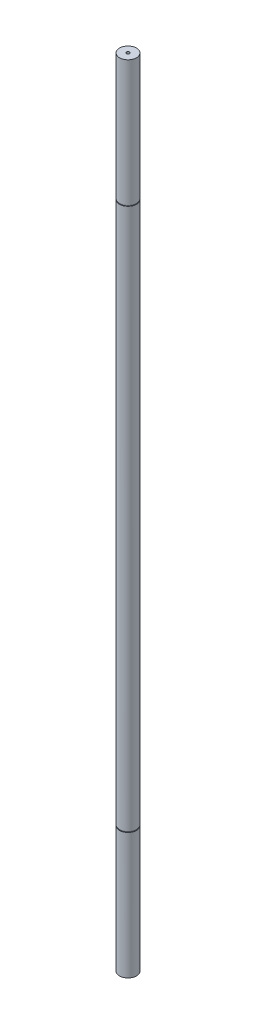
ISO-10303-21;
HEADER;
FILE_DESCRIPTION(('STEP AP214'),'2;1');
FILE_NAME('part.step','',(''),(''),'','','');
FILE_SCHEMA(('AUTOMOTIVE_DESIGN { 1 0 10303 214 1 1 1 1 }'));
ENDSEC;
DATA;
#1=APPLICATION_CONTEXT('core data for automotive mechanical design processes');
#2=APPLICATION_PROTOCOL_DEFINITION('international standard','automotive_design',2000,#1);
#3=PRODUCT_CONTEXT('',#1,'mechanical');
#4=PRODUCT('Part','Part','',(#3));
#5=PRODUCT_RELATED_PRODUCT_CATEGORY('part','',(#4));
#6=PRODUCT_DEFINITION_FORMATION('','',#4);
#7=PRODUCT_DEFINITION_CONTEXT('part definition',#1,'design');
#8=PRODUCT_DEFINITION('design','',#6,#7);
#9=PRODUCT_DEFINITION_SHAPE('','',#8);
#10=(LENGTH_UNIT() NAMED_UNIT(*) SI_UNIT(.MILLI.,.METRE.));
#11=(NAMED_UNIT(*) PLANE_ANGLE_UNIT() SI_UNIT($,.RADIAN.));
#12=(NAMED_UNIT(*) SI_UNIT($,.STERADIAN.) SOLID_ANGLE_UNIT());
#13=UNCERTAINTY_MEASURE_WITH_UNIT(LENGTH_MEASURE(1.E-05),#10,'distance_accuracy_value','');
#14=(GEOMETRIC_REPRESENTATION_CONTEXT(3) GLOBAL_UNCERTAINTY_ASSIGNED_CONTEXT((#13)) GLOBAL_UNIT_ASSIGNED_CONTEXT((#10,
#11,#12)) REPRESENTATION_CONTEXT('',''));
#15=CARTESIAN_POINT('',(0.,0.,0.));
#16=DIRECTION('',(0.,0.,1.));
#17=DIRECTION('',(1.,0.,0.));
#18=AXIS2_PLACEMENT_3D('',#15,#16,#17);
#19=CARTESIAN_POINT('',(0.,596.9,0.));
#20=DIRECTION('',(0.,-1.,0.));
#21=DIRECTION('',(0.,0.,-1.));
#22=AXIS2_PLACEMENT_3D('',#19,#20,#21);
#23=CYLINDRICAL_SURFACE('',#22,6.35);
#24=CARTESIAN_POINT('',(0.,95.2500000000001,0.));
#25=DIRECTION('',(0.,-1.,0.));
#26=DIRECTION('',(0.,0.,-1.));
#27=AXIS2_PLACEMENT_3D('',#24,#25,#26);
#28=CIRCLE('',#27,6.35);
#29=CARTESIAN_POINT('',(0.,95.2500000000001,-6.35));
#30=VERTEX_POINT('',#29);
#31=EDGE_CURVE('E56',#30,#30,#28,.T.);
#32=ORIENTED_EDGE('',*,*,#31,.F.);
#33=EDGE_LOOP('',(#32));
#34=FACE_BOUND('',#33,.T.);
#35=CARTESIAN_POINT('',(0.,501.65,0.));
#36=DIRECTION('',(0.,1.,0.));
#37=DIRECTION('',(0.,0.,1.));
#38=AXIS2_PLACEMENT_3D('',#35,#36,#37);
#39=CIRCLE('',#38,6.35);
#40=CARTESIAN_POINT('',(0.,501.65,6.35));
#41=VERTEX_POINT('',#40);
#42=EDGE_CURVE('E62',#41,#41,#39,.T.);
#43=ORIENTED_EDGE('',*,*,#42,.F.);
#44=EDGE_LOOP('',(#43));
#45=FACE_BOUND('',#44,.T.);
#46=ADVANCED_FACE('F35',(#34,#45),#23,.T.);
#47=CARTESIAN_POINT('',(0.,502.285,0.));
#48=DIRECTION('',(0.,1.,0.));
#49=DIRECTION('',(0.,0.,1.));
#50=AXIS2_PLACEMENT_3D('',#47,#48,#49);
#51=CIRCLE('',#50,6.35);
#52=CARTESIAN_POINT('',(0.,502.285,6.35));
#53=VERTEX_POINT('',#52);
#54=EDGE_CURVE('E39',#53,#53,#51,.T.);
#55=ORIENTED_EDGE('',*,*,#54,.T.);
#56=EDGE_LOOP('',(#55));
#57=FACE_BOUND('',#56,.T.);
#58=CARTESIAN_POINT('',(0.,596.9,0.));
#59=DIRECTION('',(0.,1.,0.));
#60=DIRECTION('',(0.,0.,1.));
#61=AXIS2_PLACEMENT_3D('',#58,#59,#60);
#62=CIRCLE('',#61,6.35);
#63=CARTESIAN_POINT('',(0.,596.9,6.35));
#64=VERTEX_POINT('',#63);
#65=EDGE_CURVE('E11',#64,#64,#62,.T.);
#66=ORIENTED_EDGE('',*,*,#65,.F.);
#67=EDGE_LOOP('',(#66));
#68=FACE_BOUND('',#67,.T.);
#69=ADVANCED_FACE('F92',(#57,#68),#23,.T.);
#70=CARTESIAN_POINT('',(0.,94.615,0.));
#71=DIRECTION('',(0.,-1.,0.));
#72=DIRECTION('',(0.,0.,-1.));
#73=AXIS2_PLACEMENT_3D('',#70,#71,#72);
#74=CIRCLE('',#73,6.35);
#75=CARTESIAN_POINT('',(0.,94.615,-6.35));
#76=VERTEX_POINT('',#75);
#77=EDGE_CURVE('E59',#76,#76,#74,.T.);
#78=ORIENTED_EDGE('',*,*,#77,.T.);
#79=EDGE_LOOP('',(#78));
#80=FACE_BOUND('',#79,.T.);
#81=CARTESIAN_POINT('',(0.,0.,0.));
#82=DIRECTION('',(0.,1.,0.));
#83=DIRECTION('',(0.,0.,1.));
#84=AXIS2_PLACEMENT_3D('',#81,#82,#83);
#85=CIRCLE('',#84,6.35);
#86=CARTESIAN_POINT('',(0.,0.,6.35));
#87=VERTEX_POINT('',#86);
#88=EDGE_CURVE('E43',#87,#87,#85,.T.);
#89=ORIENTED_EDGE('',*,*,#88,.T.);
#90=EDGE_LOOP('',(#89));
#91=FACE_BOUND('',#90,.T.);
#92=ADVANCED_FACE('F37',(#80,#91),#23,.T.);
#93=CARTESIAN_POINT('',(0.,596.9,0.));
#94=DIRECTION('',(0.,1.,0.));
#95=DIRECTION('',(0.,0.,1.));
#96=AXIS2_PLACEMENT_3D('',#93,#94,#95);
#97=PLANE('',#96);
#98=CARTESIAN_POINT('',(0.,596.9,0.));
#99=DIRECTION('',(0.,1.,0.));
#100=DIRECTION('',(0.,0.,1.));
#101=AXIS2_PLACEMENT_3D('',#98,#99,#100);
#102=CIRCLE('',#101,1.190625);
#103=CARTESIAN_POINT('',(0.,596.9,1.190625));
#104=VERTEX_POINT('',#103);
#105=EDGE_CURVE('E51',#104,#104,#102,.T.);
#106=ORIENTED_EDGE('',*,*,#105,.F.);
#107=EDGE_LOOP('',(#106));
#108=FACE_BOUND('',#107,.T.);
#109=ORIENTED_EDGE('',*,*,#65,.T.);
#110=EDGE_LOOP('',(#109));
#111=FACE_BOUND('',#110,.T.);
#112=ADVANCED_FACE('F99',(#108,#111),#97,.T.);
#113=CARTESIAN_POINT('',(0.,0.,0.));
#114=DIRECTION('',(0.,1.,0.));
#115=DIRECTION('',(0.,0.,1.));
#116=AXIS2_PLACEMENT_3D('',#113,#114,#115);
#117=PLANE('',#116);
#118=CARTESIAN_POINT('',(0.,0.,0.));
#119=DIRECTION('',(0.,1.,0.));
#120=DIRECTION('',(0.,0.,1.));
#121=AXIS2_PLACEMENT_3D('',#118,#119,#120);
#122=CIRCLE('',#121,1.190625);
#123=CARTESIAN_POINT('',(0.,0.,1.190625));
#124=VERTEX_POINT('',#123);
#125=EDGE_CURVE('E48',#124,#124,#122,.T.);
#126=ORIENTED_EDGE('',*,*,#125,.T.);
#127=EDGE_LOOP('',(#126));
#128=FACE_BOUND('',#127,.T.);
#129=ORIENTED_EDGE('',*,*,#88,.F.);
#130=EDGE_LOOP('',(#129));
#131=FACE_BOUND('',#130,.T.);
#132=ADVANCED_FACE('F106',(#128,#131),#117,.F.);
#133=CARTESIAN_POINT('',(0.,-12.7,0.));
#134=DIRECTION('',(0.,1.,0.));
#135=DIRECTION('',(0.,0.,1.));
#136=AXIS2_PLACEMENT_3D('',#133,#134,#135);
#137=CYLINDRICAL_SURFACE('',#136,1.190625);
#138=CARTESIAN_POINT('',(0.,596.9,1.190625));
#139=CARTESIAN_POINT('',(0.,590.682291666667,1.190625));
#140=CARTESIAN_POINT('',(0.,584.464583333333,1.190625));
#141=CARTESIAN_POINT('',(0.,572.029166666667,1.190625));
#142=CARTESIAN_POINT('',(0.,565.811458333333,1.190625));
#143=CARTESIAN_POINT('',(0.,553.376041666667,1.190625));
#144=CARTESIAN_POINT('',(0.,547.158333333333,1.190625));
#145=CARTESIAN_POINT('',(0.,534.722916666667,1.190625));
#146=CARTESIAN_POINT('',(0.,528.505208333333,1.190625));
#147=CARTESIAN_POINT('',(0.,516.069791666667,1.190625));
#148=CARTESIAN_POINT('',(0.,509.852083333333,1.190625));
#149=CARTESIAN_POINT('',(0.,497.416666666667,1.190625));
#150=CARTESIAN_POINT('',(0.,491.198958333333,1.190625));
#151=CARTESIAN_POINT('',(0.,478.763541666667,1.190625));
#152=CARTESIAN_POINT('',(0.,472.545833333333,1.190625));
#153=CARTESIAN_POINT('',(0.,460.110416666667,1.190625));
#154=CARTESIAN_POINT('',(0.,453.892708333333,1.190625));
#155=CARTESIAN_POINT('',(0.,441.457291666667,1.190625));
#156=CARTESIAN_POINT('',(0.,435.239583333333,1.190625));
#157=CARTESIAN_POINT('',(0.,422.804166666667,1.190625));
#158=CARTESIAN_POINT('',(0.,416.586458333333,1.190625));
#159=CARTESIAN_POINT('',(0.,404.151041666667,1.190625));
#160=CARTESIAN_POINT('',(0.,397.933333333333,1.190625));
#161=CARTESIAN_POINT('',(0.,385.497916666667,1.190625));
#162=CARTESIAN_POINT('',(0.,379.280208333333,1.190625));
#163=CARTESIAN_POINT('',(0.,366.844791666667,1.190625));
#164=CARTESIAN_POINT('',(0.,360.627083333333,1.190625));
#165=CARTESIAN_POINT('',(0.,348.191666666667,1.190625));
#166=CARTESIAN_POINT('',(0.,341.973958333333,1.190625));
#167=CARTESIAN_POINT('',(0.,329.538541666667,1.190625));
#168=CARTESIAN_POINT('',(0.,323.320833333333,1.190625));
#169=CARTESIAN_POINT('',(0.,310.885416666667,1.190625));
#170=CARTESIAN_POINT('',(0.,304.667708333333,1.190625));
#171=CARTESIAN_POINT('',(0.,292.232291666667,1.190625));
#172=CARTESIAN_POINT('',(0.,286.014583333333,1.190625));
#173=CARTESIAN_POINT('',(0.,273.579166666667,1.190625));
#174=CARTESIAN_POINT('',(0.,267.361458333333,1.190625));
#175=CARTESIAN_POINT('',(0.,254.926041666667,1.190625));
#176=CARTESIAN_POINT('',(0.,248.708333333333,1.190625));
#177=CARTESIAN_POINT('',(0.,236.272916666667,1.190625));
#178=CARTESIAN_POINT('',(0.,230.055208333333,1.190625));
#179=CARTESIAN_POINT('',(0.,217.619791666667,1.190625));
#180=CARTESIAN_POINT('',(0.,211.402083333333,1.190625));
#181=CARTESIAN_POINT('',(0.,198.966666666667,1.190625));
#182=CARTESIAN_POINT('',(0.,192.748958333333,1.190625));
#183=CARTESIAN_POINT('',(0.,180.313541666667,1.190625));
#184=CARTESIAN_POINT('',(0.,174.095833333333,1.190625));
#185=CARTESIAN_POINT('',(0.,161.660416666667,1.190625));
#186=CARTESIAN_POINT('',(0.,155.442708333333,1.190625));
#187=CARTESIAN_POINT('',(0.,143.007291666667,1.190625));
#188=CARTESIAN_POINT('',(0.,136.789583333333,1.190625));
#189=CARTESIAN_POINT('',(0.,124.354166666667,1.190625));
#190=CARTESIAN_POINT('',(0.,118.136458333333,1.190625));
#191=CARTESIAN_POINT('',(0.,105.701041666667,1.190625));
#192=CARTESIAN_POINT('',(0.,99.4833333333333,1.190625));
#193=CARTESIAN_POINT('',(0.,87.0479166666667,1.190625));
#194=CARTESIAN_POINT('',(0.,80.8302083333333,1.190625));
#195=CARTESIAN_POINT('',(0.,68.3947916666666,1.190625));
#196=CARTESIAN_POINT('',(0.,62.1770833333333,1.190625));
#197=CARTESIAN_POINT('',(0.,49.7416666666667,1.190625));
#198=CARTESIAN_POINT('',(0.,43.5239583333333,1.190625));
#199=CARTESIAN_POINT('',(0.,31.0885416666667,1.190625));
#200=CARTESIAN_POINT('',(0.,24.8708333333334,1.190625));
#201=CARTESIAN_POINT('',(0.,12.4354166666667,1.190625));
#202=CARTESIAN_POINT('',(0.,6.21770833333334,1.190625));
#203=CARTESIAN_POINT('',(0.,0.,1.190625));
#204=B_SPLINE_CURVE_WITH_KNOTS('',3,(#138,#139,#140,#141,#142,#143,#144,#145,#146,#147,#148,
#149,#150,#151,#152,#153,#154,#155,#156,#157,#158,#159,#160,#161,#162,#163,#164,#165,#166,#167,
#168,#169,#170,#171,#172,#173,#174,#175,#176,#177,#178,#179,#180,#181,#182,#183,#184,#185,#186,
#187,#188,#189,#190,#191,#192,#193,#194,#195,#196,#197,#198,#199,#200,#201,#202,#203),
.UNSPECIFIED.,.F.,.F.,(4,2,2,2,2,2,2,2,2,2,2,2,2,2,2,2,2,2,2,2,2,2,2,2,2,2,2,2,2,2,2,2,4),(0.,
18.653125,37.30625,55.959375,74.6125,93.265625,111.91875,130.571875,149.225,167.878125,
186.53125,205.184375,223.8375,242.490625,261.14375,279.796875,298.45,317.103125,335.75625,
354.409375,373.0625,391.715625,410.36875,429.021875,447.675,466.328125,484.98125,503.634375,
522.2875,540.940625,559.59375,578.246875,596.9),.UNSPECIFIED.);
#205=EDGE_CURVE('BSEAM114',#104,#124,#204,.T.);
#206=ORIENTED_EDGE('',*,*,#105,.T.);
#207=ORIENTED_EDGE('',*,*,#125,.F.);
#208=ORIENTED_EDGE('',*,*,#205,.T.);
#209=ORIENTED_EDGE('',*,*,#205,.F.);
#210=EDGE_LOOP('',(#206,#208,#207,#209));
#211=FACE_BOUND('',#210,.T.);
#212=ADVANCED_FACE('F114',(#211),#137,.F.);
#213=CARTESIAN_POINT('',(0.,94.615,0.));
#214=DIRECTION('',(0.,-1.,0.));
#215=DIRECTION('',(0.,0.,-1.));
#216=AXIS2_PLACEMENT_3D('',#213,#214,#215);
#217=PLANE('',#216);
#218=CARTESIAN_POINT('',(0.,94.615,0.));
#219=DIRECTION('',(0.,-1.,0.));
#220=DIRECTION('',(0.,0.,-1.));
#221=AXIS2_PLACEMENT_3D('',#218,#219,#220);
#222=CIRCLE('',#221,5.9563);
#223=CARTESIAN_POINT('',(0.,94.615,-5.9563));
#224=VERTEX_POINT('',#223);
#225=EDGE_CURVE('E60',#224,#224,#222,.T.);
#226=ORIENTED_EDGE('',*,*,#225,.T.);
#227=EDGE_LOOP('',(#226));
#228=FACE_BOUND('',#227,.T.);
#229=ORIENTED_EDGE('',*,*,#77,.F.);
#230=EDGE_LOOP('',(#229));
#231=FACE_BOUND('',#230,.T.);
#232=ADVANCED_FACE('F86',(#228,#231),#217,.F.);
#233=CARTESIAN_POINT('',(0.,95.25,0.));
#234=DIRECTION('',(0.,-1.,0.));
#235=DIRECTION('',(0.,0.,-1.));
#236=AXIS2_PLACEMENT_3D('',#233,#234,#235);
#237=PLANE('',#236);
#238=CARTESIAN_POINT('',(0.,95.25,0.));
#239=DIRECTION('',(0.,-1.,0.));
#240=DIRECTION('',(0.,0.,-1.));
#241=AXIS2_PLACEMENT_3D('',#238,#239,#240);
#242=CIRCLE('',#241,5.9563);
#243=CARTESIAN_POINT('',(0.,95.25,-5.9563));
#244=VERTEX_POINT('',#243);
#245=EDGE_CURVE('E68',#244,#244,#242,.T.);
#246=ORIENTED_EDGE('',*,*,#245,.F.);
#247=EDGE_LOOP('',(#246));
#248=FACE_BOUND('',#247,.T.);
#249=ORIENTED_EDGE('',*,*,#31,.T.);
#250=EDGE_LOOP('',(#249));
#251=FACE_BOUND('',#250,.T.);
#252=ADVANCED_FACE('F83',(#248,#251),#237,.T.);
#253=CARTESIAN_POINT('',(0.,94.615,0.));
#254=DIRECTION('',(0.,1.,0.));
#255=DIRECTION('',(0.,0.,1.));
#256=AXIS2_PLACEMENT_3D('',#253,#254,#255);
#257=CYLINDRICAL_SURFACE('',#256,5.9563);
#258=ORIENTED_EDGE('',*,*,#225,.F.);
#259=EDGE_LOOP('',(#258));
#260=FACE_BOUND('',#259,.T.);
#261=ORIENTED_EDGE('',*,*,#245,.T.);
#262=EDGE_LOOP('',(#261));
#263=FACE_BOUND('',#262,.T.);
#264=ADVANCED_FACE('F81',(#260,#263),#257,.T.);
#265=CARTESIAN_POINT('',(0.,502.285,0.));
#266=DIRECTION('',(0.,1.,0.));
#267=DIRECTION('',(0.,0.,1.));
#268=AXIS2_PLACEMENT_3D('',#265,#266,#267);
#269=PLANE('',#268);
#270=CARTESIAN_POINT('',(0.,502.285,0.));
#271=DIRECTION('',(0.,-1.,0.));
#272=DIRECTION('',(0.,0.,-1.));
#273=AXIS2_PLACEMENT_3D('',#270,#271,#272);
#274=CIRCLE('',#273,5.9563);
#275=CARTESIAN_POINT('',(0.,502.285,-5.9563));
#276=VERTEX_POINT('',#275);
#277=EDGE_CURVE('E64',#276,#276,#274,.T.);
#278=ORIENTED_EDGE('',*,*,#277,.F.);
#279=EDGE_LOOP('',(#278));
#280=FACE_BOUND('',#279,.T.);
#281=ORIENTED_EDGE('',*,*,#54,.F.);
#282=EDGE_LOOP('',(#281));
#283=FACE_BOUND('',#282,.T.);
#284=ADVANCED_FACE('F127',(#280,#283),#269,.F.);
#285=CARTESIAN_POINT('',(0.,501.65,0.));
#286=DIRECTION('',(0.,1.,0.));
#287=DIRECTION('',(0.,0.,1.));
#288=AXIS2_PLACEMENT_3D('',#285,#286,#287);
#289=PLANE('',#288);
#290=CARTESIAN_POINT('',(0.,501.65,0.));
#291=DIRECTION('',(0.,-1.,0.));
#292=DIRECTION('',(0.,0.,-1.));
#293=AXIS2_PLACEMENT_3D('',#290,#291,#292);
#294=CIRCLE('',#293,5.9563);
#295=CARTESIAN_POINT('',(0.,501.65,-5.9563));
#296=VERTEX_POINT('',#295);
#297=EDGE_CURVE('E70',#296,#296,#294,.T.);
#298=ORIENTED_EDGE('',*,*,#297,.T.);
#299=EDGE_LOOP('',(#298));
#300=FACE_BOUND('',#299,.T.);
#301=ORIENTED_EDGE('',*,*,#42,.T.);
#302=EDGE_LOOP('',(#301));
#303=FACE_BOUND('',#302,.T.);
#304=ADVANCED_FACE('F129',(#300,#303),#289,.T.);
#305=CARTESIAN_POINT('',(0.,502.285,0.));
#306=DIRECTION('',(0.,-1.,0.));
#307=DIRECTION('',(0.,0.,-1.));
#308=AXIS2_PLACEMENT_3D('',#305,#306,#307);
#309=CYLINDRICAL_SURFACE('',#308,5.9563);
#310=ORIENTED_EDGE('',*,*,#277,.T.);
#311=EDGE_LOOP('',(#310));
#312=FACE_BOUND('',#311,.T.);
#313=ORIENTED_EDGE('',*,*,#297,.F.);
#314=EDGE_LOOP('',(#313));
#315=FACE_BOUND('',#314,.T.);
#316=ADVANCED_FACE('F132',(#312,#315),#309,.T.);
#317=CLOSED_SHELL('',(#46,#69,#92,#112,#132,#212,#232,#252,#264,#284,#304,#316));
#318=MANIFOLD_SOLID_BREP('B2',#317);
#319=ADVANCED_BREP_SHAPE_REPRESENTATION('',(#18,#318),#14);
#320=SHAPE_DEFINITION_REPRESENTATION(#9,#319);
ENDSEC;
END-ISO-10303-21;
